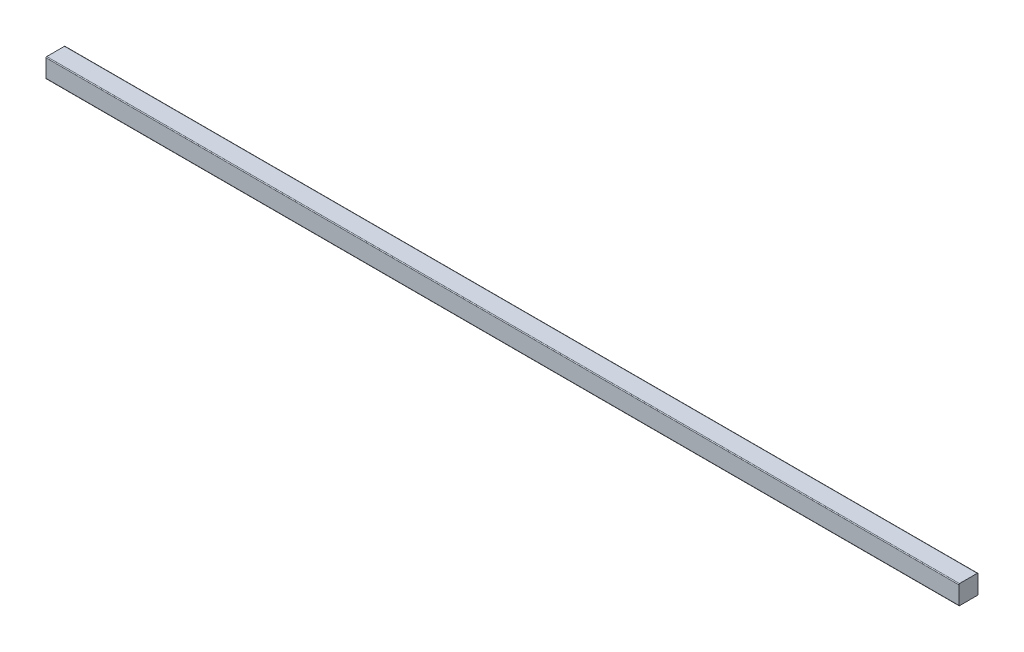
ISO-10303-21;
HEADER;
FILE_DESCRIPTION(('STEP AP214'),'2;1');
FILE_NAME('part.step','',(''),(''),'','','');
FILE_SCHEMA(('AUTOMOTIVE_DESIGN { 1 0 10303 214 1 1 1 1 }'));
ENDSEC;
DATA;
#1=APPLICATION_CONTEXT('core data for automotive mechanical design processes');
#2=APPLICATION_PROTOCOL_DEFINITION('international standard','automotive_design',2000,#1);
#3=PRODUCT_CONTEXT('',#1,'mechanical');
#4=PRODUCT('Part','Part','',(#3));
#5=PRODUCT_RELATED_PRODUCT_CATEGORY('part','',(#4));
#6=PRODUCT_DEFINITION_FORMATION('','',#4);
#7=PRODUCT_DEFINITION_CONTEXT('part definition',#1,'design');
#8=PRODUCT_DEFINITION('design','',#6,#7);
#9=PRODUCT_DEFINITION_SHAPE('','',#8);
#10=(LENGTH_UNIT() NAMED_UNIT(*) SI_UNIT(.MILLI.,.METRE.));
#11=(NAMED_UNIT(*) PLANE_ANGLE_UNIT() SI_UNIT($,.RADIAN.));
#12=(NAMED_UNIT(*) SI_UNIT($,.STERADIAN.) SOLID_ANGLE_UNIT());
#13=UNCERTAINTY_MEASURE_WITH_UNIT(LENGTH_MEASURE(1.E-05),#10,'distance_accuracy_value','');
#14=(GEOMETRIC_REPRESENTATION_CONTEXT(3) GLOBAL_UNCERTAINTY_ASSIGNED_CONTEXT((#13)) GLOBAL_UNIT_ASSIGNED_CONTEXT((#10,
#11,#12)) REPRESENTATION_CONTEXT('',''));
#15=CARTESIAN_POINT('',(0.,0.,0.));
#16=DIRECTION('',(0.,0.,1.));
#17=DIRECTION('',(1.,0.,0.));
#18=AXIS2_PLACEMENT_3D('',#15,#16,#17);
#19=CARTESIAN_POINT('',(301.625,-3.175,3.175));
#20=DIRECTION('',(0.,0.,-1.));
#21=DIRECTION('',(1.,0.,0.));
#22=AXIS2_PLACEMENT_3D('',#19,#20,#21);
#23=PLANE('',#22);
#24=DIRECTION('',(0.,1.,0.));
#25=VECTOR('',#24,1.);
#26=CARTESIAN_POINT('',(301.625,-3.175,3.175));
#27=LINE('',#26,#25);
#28=CARTESIAN_POINT('',(301.625,-2.921,3.175));
#29=VERTEX_POINT('',#28);
#30=CARTESIAN_POINT('',(301.625,2.921,3.175));
#31=VERTEX_POINT('',#30);
#32=EDGE_CURVE('E165',#29,#31,#27,.T.);
#33=ORIENTED_EDGE('',*,*,#32,.T.);
#34=DIRECTION('',(-1.,0.,0.));
#35=VECTOR('',#34,1.);
#36=CARTESIAN_POINT('',(301.625,2.921,3.175));
#37=LINE('',#36,#35);
#38=CARTESIAN_POINT('',(0.,2.921,3.175));
#39=VERTEX_POINT('',#38);
#40=EDGE_CURVE('E145',#39,#31,#37,.F.);
#41=ORIENTED_EDGE('',*,*,#40,.F.);
#42=DIRECTION('',(0.,1.,0.));
#43=VECTOR('',#42,1.);
#44=CARTESIAN_POINT('',(0.,-3.175,3.175));
#45=LINE('',#44,#43);
#46=CARTESIAN_POINT('',(0.,-2.921,3.175));
#47=VERTEX_POINT('',#46);
#48=EDGE_CURVE('E125',#47,#39,#45,.T.);
#49=ORIENTED_EDGE('',*,*,#48,.F.);
#50=DIRECTION('',(-1.,0.,0.));
#51=VECTOR('',#50,1.);
#52=CARTESIAN_POINT('',(301.625,-2.921,3.175));
#53=LINE('',#52,#51);
#54=EDGE_CURVE('E137',#29,#47,#53,.T.);
#55=ORIENTED_EDGE('',*,*,#54,.F.);
#56=EDGE_LOOP('',(#33,#41,#49,#55));
#57=FACE_BOUND('',#56,.T.);
#58=ADVANCED_FACE('F47',(#57),#23,.F.);
#59=CARTESIAN_POINT('',(301.625,3.175,-3.175));
#60=DIRECTION('',(0.,-1.,0.));
#61=DIRECTION('',(0.,0.,1.));
#62=AXIS2_PLACEMENT_3D('',#59,#60,#61);
#63=PLANE('',#62);
#64=DIRECTION('',(0.,0.,-1.));
#65=VECTOR('',#64,1.);
#66=CARTESIAN_POINT('',(0.,3.175,-3.175));
#67=LINE('',#66,#65);
#68=CARTESIAN_POINT('',(0.,3.175,2.921));
#69=VERTEX_POINT('',#68);
#70=CARTESIAN_POINT('',(0.,3.175,-2.921));
#71=VERTEX_POINT('',#70);
#72=EDGE_CURVE('E149',#69,#71,#67,.T.);
#73=ORIENTED_EDGE('',*,*,#72,.F.);
#74=DIRECTION('',(-1.,0.,0.));
#75=VECTOR('',#74,1.);
#76=CARTESIAN_POINT('',(301.625,3.175,2.921));
#77=LINE('',#76,#75);
#78=CARTESIAN_POINT('',(301.625,3.175,2.921));
#79=VERTEX_POINT('',#78);
#80=EDGE_CURVE('E56',#79,#69,#77,.T.);
#81=ORIENTED_EDGE('',*,*,#80,.F.);
#82=DIRECTION('',(0.,0.,-1.));
#83=VECTOR('',#82,1.);
#84=CARTESIAN_POINT('',(301.625,3.175,-3.175));
#85=LINE('',#84,#83);
#86=CARTESIAN_POINT('',(301.625,3.175,-2.921));
#87=VERTEX_POINT('',#86);
#88=EDGE_CURVE('E214',#79,#87,#85,.T.);
#89=ORIENTED_EDGE('',*,*,#88,.T.);
#90=DIRECTION('',(-1.,0.,0.));
#91=VECTOR('',#90,1.);
#92=CARTESIAN_POINT('',(301.625,3.175,-2.921));
#93=LINE('',#92,#91);
#94=EDGE_CURVE('E11',#71,#87,#93,.F.);
#95=ORIENTED_EDGE('',*,*,#94,.F.);
#96=EDGE_LOOP('',(#73,#81,#89,#95));
#97=FACE_BOUND('',#96,.T.);
#98=ADVANCED_FACE('F199',(#97),#63,.F.);
#99=CARTESIAN_POINT('',(301.625,-3.175,-3.175));
#100=DIRECTION('',(0.,0.,1.));
#101=DIRECTION('',(-1.,0.,0.));
#102=AXIS2_PLACEMENT_3D('',#99,#100,#101);
#103=PLANE('',#102);
#104=DIRECTION('',(0.,-1.,0.));
#105=VECTOR('',#104,1.);
#106=CARTESIAN_POINT('',(0.,-3.175,-3.175));
#107=LINE('',#106,#105);
#108=CARTESIAN_POINT('',(0.,2.921,-3.175));
#109=VERTEX_POINT('',#108);
#110=CARTESIAN_POINT('',(0.,-2.921,-3.175));
#111=VERTEX_POINT('',#110);
#112=EDGE_CURVE('E154',#109,#111,#107,.T.);
#113=ORIENTED_EDGE('',*,*,#112,.F.);
#114=DIRECTION('',(-1.,0.,0.));
#115=VECTOR('',#114,1.);
#116=CARTESIAN_POINT('',(301.625,2.921,-3.175));
#117=LINE('',#116,#115);
#118=CARTESIAN_POINT('',(301.625,2.921,-3.175));
#119=VERTEX_POINT('',#118);
#120=EDGE_CURVE('E185',#119,#109,#117,.T.);
#121=ORIENTED_EDGE('',*,*,#120,.F.);
#122=DIRECTION('',(0.,-1.,0.));
#123=VECTOR('',#122,1.);
#124=CARTESIAN_POINT('',(301.625,-3.175,-3.175));
#125=LINE('',#124,#123);
#126=CARTESIAN_POINT('',(301.625,-2.921,-3.175));
#127=VERTEX_POINT('',#126);
#128=EDGE_CURVE('E207',#119,#127,#125,.T.);
#129=ORIENTED_EDGE('',*,*,#128,.T.);
#130=DIRECTION('',(-1.,0.,0.));
#131=VECTOR('',#130,1.);
#132=CARTESIAN_POINT('',(301.625,-2.921,-3.175));
#133=LINE('',#132,#131);
#134=EDGE_CURVE('E188',#111,#127,#133,.F.);
#135=ORIENTED_EDGE('',*,*,#134,.F.);
#136=EDGE_LOOP('',(#113,#121,#129,#135));
#137=FACE_BOUND('',#136,.T.);
#138=ADVANCED_FACE('F206',(#137),#103,.F.);
#139=CARTESIAN_POINT('',(301.625,-3.175,-3.175));
#140=DIRECTION('',(0.,1.,0.));
#141=DIRECTION('',(0.,0.,-1.));
#142=AXIS2_PLACEMENT_3D('',#139,#140,#141);
#143=PLANE('',#142);
#144=DIRECTION('',(0.,0.,1.));
#145=VECTOR('',#144,1.);
#146=CARTESIAN_POINT('',(0.,-3.175,-3.175));
#147=LINE('',#146,#145);
#148=CARTESIAN_POINT('',(0.,-3.175,-2.921));
#149=VERTEX_POINT('',#148);
#150=CARTESIAN_POINT('',(0.,-3.175,2.921));
#151=VERTEX_POINT('',#150);
#152=EDGE_CURVE('E128',#149,#151,#147,.T.);
#153=ORIENTED_EDGE('',*,*,#152,.F.);
#154=DIRECTION('',(-1.,0.,0.));
#155=VECTOR('',#154,1.);
#156=CARTESIAN_POINT('',(301.625,-3.175,-2.921));
#157=LINE('',#156,#155);
#158=CARTESIAN_POINT('',(301.625,-3.175,-2.921));
#159=VERTEX_POINT('',#158);
#160=EDGE_CURVE('E133',#159,#149,#157,.T.);
#161=ORIENTED_EDGE('',*,*,#160,.F.);
#162=DIRECTION('',(0.,0.,1.));
#163=VECTOR('',#162,1.);
#164=CARTESIAN_POINT('',(301.625,-3.175,-3.175));
#165=LINE('',#164,#163);
#166=CARTESIAN_POINT('',(301.625,-3.175,2.921));
#167=VERTEX_POINT('',#166);
#168=EDGE_CURVE('E157',#159,#167,#165,.T.);
#169=ORIENTED_EDGE('',*,*,#168,.T.);
#170=DIRECTION('',(-1.,0.,0.));
#171=VECTOR('',#170,1.);
#172=CARTESIAN_POINT('',(301.625,-3.175,2.921));
#173=LINE('',#172,#171);
#174=EDGE_CURVE('E177',#151,#167,#173,.F.);
#175=ORIENTED_EDGE('',*,*,#174,.F.);
#176=EDGE_LOOP('',(#153,#161,#169,#175));
#177=FACE_BOUND('',#176,.T.);
#178=ADVANCED_FACE('F213',(#177),#143,.F.);
#179=CARTESIAN_POINT('',(301.625,0.,0.));
#180=DIRECTION('',(-1.,0.,0.));
#181=DIRECTION('',(0.,0.,-1.));
#182=AXIS2_PLACEMENT_3D('',#179,#180,#181);
#183=PLANE('',#182);
#184=ORIENTED_EDGE('',*,*,#168,.F.);
#185=CARTESIAN_POINT('',(301.625,-2.921,-2.921));
#186=DIRECTION('',(1.,0.,0.));
#187=DIRECTION('',(0.,0.,-1.));
#188=AXIS2_PLACEMENT_3D('',#185,#186,#187);
#189=CIRCLE('',#188,0.254);
#190=EDGE_CURVE('E63',#127,#159,#189,.F.);
#191=ORIENTED_EDGE('',*,*,#190,.F.);
#192=ORIENTED_EDGE('',*,*,#128,.F.);
#193=CARTESIAN_POINT('',(301.625,2.921,-2.921));
#194=DIRECTION('',(1.,0.,0.));
#195=DIRECTION('',(0.,0.,-1.));
#196=AXIS2_PLACEMENT_3D('',#193,#194,#195);
#197=CIRCLE('',#196,0.254);
#198=EDGE_CURVE('E70',#87,#119,#197,.F.);
#199=ORIENTED_EDGE('',*,*,#198,.F.);
#200=ORIENTED_EDGE('',*,*,#88,.F.);
#201=CARTESIAN_POINT('',(301.625,2.921,2.921));
#202=DIRECTION('',(1.,0.,0.));
#203=DIRECTION('',(0.,0.,-1.));
#204=AXIS2_PLACEMENT_3D('',#201,#202,#203);
#205=CIRCLE('',#204,0.254);
#206=EDGE_CURVE('E180',#31,#79,#205,.F.);
#207=ORIENTED_EDGE('',*,*,#206,.F.);
#208=ORIENTED_EDGE('',*,*,#32,.F.);
#209=CARTESIAN_POINT('',(301.625,-2.921,2.921));
#210=DIRECTION('',(1.,0.,0.));
#211=DIRECTION('',(0.,0.,-1.));
#212=AXIS2_PLACEMENT_3D('',#209,#210,#211);
#213=CIRCLE('',#212,0.254);
#214=EDGE_CURVE('E139',#167,#29,#213,.F.);
#215=ORIENTED_EDGE('',*,*,#214,.F.);
#216=EDGE_LOOP('',(#184,#191,#192,#199,#200,#207,#208,#215));
#217=FACE_BOUND('',#216,.T.);
#218=ADVANCED_FACE('F217',(#217),#183,.F.);
#219=CARTESIAN_POINT('',(0.,0.,0.));
#220=DIRECTION('',(-1.,0.,0.));
#221=DIRECTION('',(0.,0.,-1.));
#222=AXIS2_PLACEMENT_3D('',#219,#220,#221);
#223=PLANE('',#222);
#224=ORIENTED_EDGE('',*,*,#48,.T.);
#225=CARTESIAN_POINT('',(0.,2.921,2.921));
#226=DIRECTION('',(1.,0.,0.));
#227=DIRECTION('',(0.,0.,-1.));
#228=AXIS2_PLACEMENT_3D('',#225,#226,#227);
#229=CIRCLE('',#228,0.254);
#230=EDGE_CURVE('E144',#69,#39,#229,.T.);
#231=ORIENTED_EDGE('',*,*,#230,.F.);
#232=ORIENTED_EDGE('',*,*,#72,.T.);
#233=CARTESIAN_POINT('',(0.,2.921,-2.921));
#234=DIRECTION('',(1.,0.,0.));
#235=DIRECTION('',(0.,0.,-1.));
#236=AXIS2_PLACEMENT_3D('',#233,#234,#235);
#237=CIRCLE('',#236,0.254);
#238=EDGE_CURVE('E170',#109,#71,#237,.T.);
#239=ORIENTED_EDGE('',*,*,#238,.F.);
#240=ORIENTED_EDGE('',*,*,#112,.T.);
#241=CARTESIAN_POINT('',(0.,-2.921,-2.921));
#242=DIRECTION('',(1.,0.,0.));
#243=DIRECTION('',(0.,0.,-1.));
#244=AXIS2_PLACEMENT_3D('',#241,#242,#243);
#245=CIRCLE('',#244,0.254);
#246=EDGE_CURVE('E134',#149,#111,#245,.T.);
#247=ORIENTED_EDGE('',*,*,#246,.F.);
#248=ORIENTED_EDGE('',*,*,#152,.T.);
#249=CARTESIAN_POINT('',(0.,-2.921,2.921));
#250=DIRECTION('',(1.,0.,0.));
#251=DIRECTION('',(0.,0.,-1.));
#252=AXIS2_PLACEMENT_3D('',#249,#250,#251);
#253=CIRCLE('',#252,0.254);
#254=EDGE_CURVE('E121',#47,#151,#253,.T.);
#255=ORIENTED_EDGE('',*,*,#254,.F.);
#256=EDGE_LOOP('',(#224,#231,#232,#239,#240,#247,#248,#255));
#257=FACE_BOUND('',#256,.T.);
#258=ADVANCED_FACE('F123',(#257),#223,.T.);
#259=CARTESIAN_POINT('',(301.625,-2.921,2.921));
#260=DIRECTION('',(-1.,0.,0.));
#261=DIRECTION('',(0.,0.,-1.));
#262=AXIS2_PLACEMENT_3D('',#259,#260,#261);
#263=CYLINDRICAL_SURFACE('',#262,0.254);
#264=ORIENTED_EDGE('',*,*,#214,.T.);
#265=ORIENTED_EDGE('',*,*,#54,.T.);
#266=ORIENTED_EDGE('',*,*,#254,.T.);
#267=ORIENTED_EDGE('',*,*,#174,.T.);
#268=EDGE_LOOP('',(#264,#265,#266,#267));
#269=FACE_BOUND('',#268,.T.);
#270=ADVANCED_FACE('F138',(#269),#263,.T.);
#271=CARTESIAN_POINT('',(301.625,-2.921,-2.921));
#272=DIRECTION('',(-1.,0.,0.));
#273=DIRECTION('',(0.,0.,-1.));
#274=AXIS2_PLACEMENT_3D('',#271,#272,#273);
#275=CYLINDRICAL_SURFACE('',#274,0.254);
#276=ORIENTED_EDGE('',*,*,#190,.T.);
#277=ORIENTED_EDGE('',*,*,#160,.T.);
#278=ORIENTED_EDGE('',*,*,#246,.T.);
#279=ORIENTED_EDGE('',*,*,#134,.T.);
#280=EDGE_LOOP('',(#276,#277,#278,#279));
#281=FACE_BOUND('',#280,.T.);
#282=ADVANCED_FACE('F209',(#281),#275,.T.);
#283=CARTESIAN_POINT('',(301.625,2.921,-2.921));
#284=DIRECTION('',(-1.,0.,0.));
#285=DIRECTION('',(0.,0.,-1.));
#286=AXIS2_PLACEMENT_3D('',#283,#284,#285);
#287=CYLINDRICAL_SURFACE('',#286,0.254);
#288=ORIENTED_EDGE('',*,*,#198,.T.);
#289=ORIENTED_EDGE('',*,*,#120,.T.);
#290=ORIENTED_EDGE('',*,*,#238,.T.);
#291=ORIENTED_EDGE('',*,*,#94,.T.);
#292=EDGE_LOOP('',(#288,#289,#290,#291));
#293=FACE_BOUND('',#292,.T.);
#294=ADVANCED_FACE('F202',(#293),#287,.T.);
#295=CARTESIAN_POINT('',(301.625,2.921,2.921));
#296=DIRECTION('',(-1.,0.,0.));
#297=DIRECTION('',(0.,0.,-1.));
#298=AXIS2_PLACEMENT_3D('',#295,#296,#297);
#299=CYLINDRICAL_SURFACE('',#298,0.254);
#300=ORIENTED_EDGE('',*,*,#206,.T.);
#301=ORIENTED_EDGE('',*,*,#80,.T.);
#302=ORIENTED_EDGE('',*,*,#230,.T.);
#303=ORIENTED_EDGE('',*,*,#40,.T.);
#304=EDGE_LOOP('',(#300,#301,#302,#303));
#305=FACE_BOUND('',#304,.T.);
#306=ADVANCED_FACE('F49',(#305),#299,.T.);
#307=CLOSED_SHELL('',(#58,#98,#138,#178,#218,#258,#270,#282,#294,#306));
#308=MANIFOLD_SOLID_BREP('B2',#307);
#309=ADVANCED_BREP_SHAPE_REPRESENTATION('',(#18,#308),#14);
#310=SHAPE_DEFINITION_REPRESENTATION(#9,#309);
ENDSEC;
END-ISO-10303-21;
